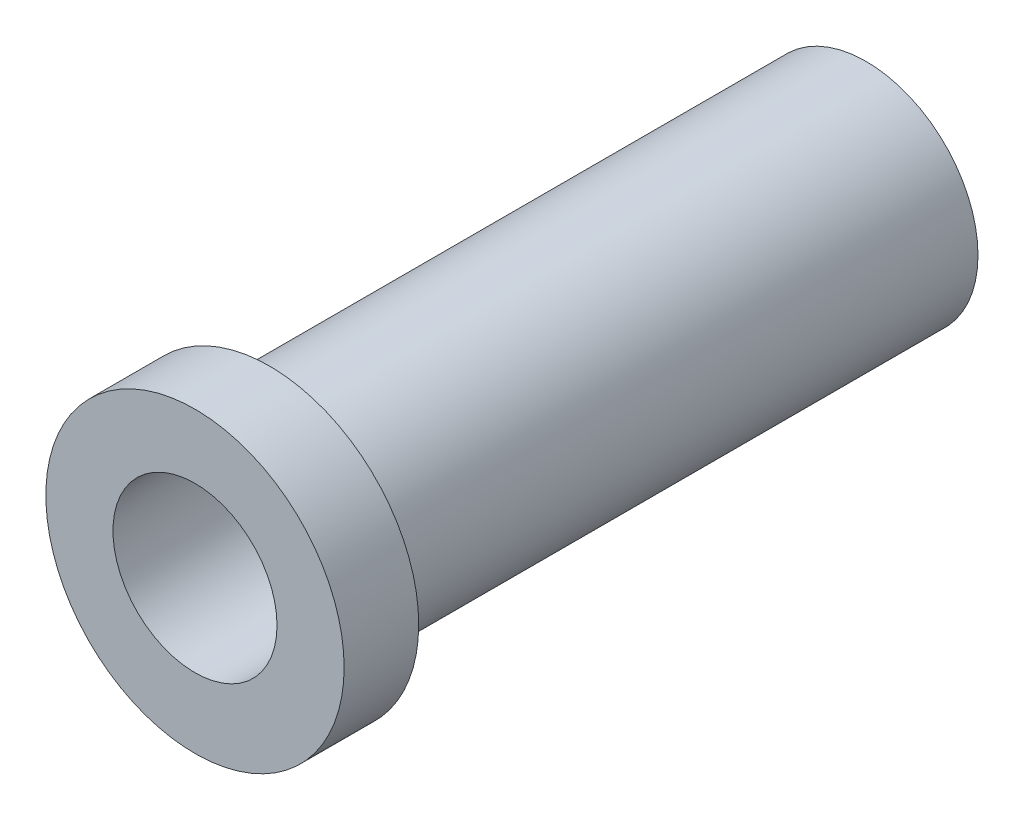
ISO-10303-21;
HEADER;
FILE_DESCRIPTION(('STEP AP214'),'2;1');
FILE_NAME('part.step','',(''),(''),'','','');
FILE_SCHEMA(('AUTOMOTIVE_DESIGN { 1 0 10303 214 1 1 1 1 }'));
ENDSEC;
DATA;
#1=APPLICATION_CONTEXT('core data for automotive mechanical design processes');
#2=APPLICATION_PROTOCOL_DEFINITION('international standard','automotive_design',2000,#1);
#3=PRODUCT_CONTEXT('',#1,'mechanical');
#4=PRODUCT('Part','Part','',(#3));
#5=PRODUCT_RELATED_PRODUCT_CATEGORY('part','',(#4));
#6=PRODUCT_DEFINITION_FORMATION('','',#4);
#7=PRODUCT_DEFINITION_CONTEXT('part definition',#1,'design');
#8=PRODUCT_DEFINITION('design','',#6,#7);
#9=PRODUCT_DEFINITION_SHAPE('','',#8);
#10=(LENGTH_UNIT() NAMED_UNIT(*) SI_UNIT(.MILLI.,.METRE.));
#11=(NAMED_UNIT(*) PLANE_ANGLE_UNIT() SI_UNIT($,.RADIAN.));
#12=(NAMED_UNIT(*) SI_UNIT($,.STERADIAN.) SOLID_ANGLE_UNIT());
#13=UNCERTAINTY_MEASURE_WITH_UNIT(LENGTH_MEASURE(1.E-05),#10,'distance_accuracy_value','');
#14=(GEOMETRIC_REPRESENTATION_CONTEXT(3) GLOBAL_UNCERTAINTY_ASSIGNED_CONTEXT((#13)) GLOBAL_UNIT_ASSIGNED_CONTEXT((#10,
#11,#12)) REPRESENTATION_CONTEXT('',''));
#15=CARTESIAN_POINT('',(0.,0.,0.));
#16=DIRECTION('',(0.,0.,1.));
#17=DIRECTION('',(1.,0.,0.));
#18=AXIS2_PLACEMENT_3D('',#15,#16,#17);
#19=CARTESIAN_POINT('',(0.,0.,-40.));
#20=DIRECTION('',(0.,0.,1.));
#21=DIRECTION('',(1.,0.,0.));
#22=AXIS2_PLACEMENT_3D('',#19,#20,#21);
#23=CYLINDRICAL_SURFACE('',#22,5.5);
#24=CARTESIAN_POINT('',(0.,0.,-40.));
#25=DIRECTION('',(0.,0.,1.));
#26=DIRECTION('',(1.,0.,0.));
#27=AXIS2_PLACEMENT_3D('',#24,#25,#26);
#28=CIRCLE('',#27,5.5);
#29=CARTESIAN_POINT('',(5.50000000000002,0.,-40.));
#30=VERTEX_POINT('',#29);
#31=EDGE_CURVE('E47',#30,#30,#28,.T.);
#32=ORIENTED_EDGE('',*,*,#31,.F.);
#33=EDGE_LOOP('',(#32));
#34=FACE_BOUND('',#33,.T.);
#35=CARTESIAN_POINT('',(0.,0.,5.));
#36=DIRECTION('',(0.,0.,1.));
#37=DIRECTION('',(1.,0.,0.));
#38=AXIS2_PLACEMENT_3D('',#35,#36,#37);
#39=CIRCLE('',#38,5.5);
#40=CARTESIAN_POINT('',(5.50000000000002,0.,5.));
#41=VERTEX_POINT('',#40);
#42=EDGE_CURVE('E60',#41,#41,#39,.T.);
#43=ORIENTED_EDGE('',*,*,#42,.T.);
#44=EDGE_LOOP('',(#43));
#45=FACE_BOUND('',#44,.T.);
#46=ADVANCED_FACE('F39',(#34,#45),#23,.F.);
#47=CARTESIAN_POINT('',(0.,0.,-40.));
#48=DIRECTION('',(0.,0.,1.));
#49=DIRECTION('',(1.,0.,0.));
#50=AXIS2_PLACEMENT_3D('',#47,#48,#49);
#51=CYLINDRICAL_SURFACE('',#50,7.5);
#52=CARTESIAN_POINT('',(0.,0.,-40.));
#53=DIRECTION('',(0.,0.,1.));
#54=DIRECTION('',(1.,0.,0.));
#55=AXIS2_PLACEMENT_3D('',#52,#53,#54);
#56=CIRCLE('',#55,7.5);
#57=CARTESIAN_POINT('',(7.50000000000003,0.,-40.));
#58=VERTEX_POINT('',#57);
#59=EDGE_CURVE('E10',#58,#58,#56,.T.);
#60=ORIENTED_EDGE('',*,*,#59,.T.);
#61=EDGE_LOOP('',(#60));
#62=FACE_BOUND('',#61,.T.);
#63=CARTESIAN_POINT('',(0.,0.,0.));
#64=DIRECTION('',(0.,0.,1.));
#65=DIRECTION('',(1.,0.,0.));
#66=AXIS2_PLACEMENT_3D('',#63,#64,#65);
#67=CIRCLE('',#66,7.5);
#68=CARTESIAN_POINT('',(7.50000000000003,0.,0.));
#69=VERTEX_POINT('',#68);
#70=EDGE_CURVE('E42',#69,#69,#67,.T.);
#71=ORIENTED_EDGE('',*,*,#70,.F.);
#72=EDGE_LOOP('',(#71));
#73=FACE_BOUND('',#72,.T.);
#74=ADVANCED_FACE('F89',(#62,#73),#51,.T.);
#75=CARTESIAN_POINT('',(0.,0.,-40.));
#76=DIRECTION('',(0.,0.,1.));
#77=DIRECTION('',(1.,0.,0.));
#78=AXIS2_PLACEMENT_3D('',#75,#76,#77);
#79=PLANE('',#78);
#80=ORIENTED_EDGE('',*,*,#31,.T.);
#81=EDGE_LOOP('',(#80));
#82=FACE_BOUND('',#81,.T.);
#83=ORIENTED_EDGE('',*,*,#59,.F.);
#84=EDGE_LOOP('',(#83));
#85=FACE_BOUND('',#84,.T.);
#86=ADVANCED_FACE('F75',(#82,#85),#79,.F.);
#87=CARTESIAN_POINT('',(0.,-0.190863113120388,5.));
#88=DIRECTION('',(0.,0.,-1.));
#89=DIRECTION('',(-1.,0.,0.));
#90=AXIS2_PLACEMENT_3D('',#87,#88,#89);
#91=CYLINDRICAL_SURFACE('',#90,10.);
#92=CARTESIAN_POINT('',(0.,-0.190863113120388,5.));
#93=DIRECTION('',(0.,0.,1.));
#94=DIRECTION('',(1.,0.,0.));
#95=AXIS2_PLACEMENT_3D('',#92,#93,#94);
#96=CIRCLE('',#95,10.);
#97=CARTESIAN_POINT('',(10.,-0.190863113120388,5.));
#98=VERTEX_POINT('',#97);
#99=EDGE_CURVE('E59',#98,#98,#96,.T.);
#100=ORIENTED_EDGE('',*,*,#99,.F.);
#101=EDGE_LOOP('',(#100));
#102=FACE_BOUND('',#101,.T.);
#103=CARTESIAN_POINT('',(0.,-0.190863113120388,0.));
#104=DIRECTION('',(0.,0.,1.));
#105=DIRECTION('',(1.,0.,0.));
#106=AXIS2_PLACEMENT_3D('',#103,#104,#105);
#107=CIRCLE('',#106,10.);
#108=CARTESIAN_POINT('',(10.,-0.190863113120388,0.));
#109=VERTEX_POINT('',#108);
#110=EDGE_CURVE('E55',#109,#109,#107,.T.);
#111=ORIENTED_EDGE('',*,*,#110,.T.);
#112=EDGE_LOOP('',(#111));
#113=FACE_BOUND('',#112,.T.);
#114=ADVANCED_FACE('F72',(#102,#113),#91,.T.);
#115=CARTESIAN_POINT('',(0.,0.,5.));
#116=DIRECTION('',(0.,0.,1.));
#117=DIRECTION('',(1.,0.,0.));
#118=AXIS2_PLACEMENT_3D('',#115,#116,#117);
#119=PLANE('',#118);
#120=ORIENTED_EDGE('',*,*,#99,.T.);
#121=EDGE_LOOP('',(#120));
#122=FACE_BOUND('',#121,.T.);
#123=ORIENTED_EDGE('',*,*,#42,.F.);
#124=EDGE_LOOP('',(#123));
#125=FACE_BOUND('',#124,.T.);
#126=ADVANCED_FACE('F69',(#122,#125),#119,.T.);
#127=CARTESIAN_POINT('',(0.,0.,0.));
#128=DIRECTION('',(0.,0.,1.));
#129=DIRECTION('',(1.,0.,0.));
#130=AXIS2_PLACEMENT_3D('',#127,#128,#129);
#131=PLANE('',#130);
#132=ORIENTED_EDGE('',*,*,#70,.T.);
#133=EDGE_LOOP('',(#132));
#134=FACE_BOUND('',#133,.T.);
#135=ORIENTED_EDGE('',*,*,#110,.F.);
#136=EDGE_LOOP('',(#135));
#137=FACE_BOUND('',#136,.T.);
#138=ADVANCED_FACE('F79',(#134,#137),#131,.F.);
#139=CLOSED_SHELL('',(#46,#74,#86,#114,#126,#138));
#140=MANIFOLD_SOLID_BREP('B2',#139);
#141=ADVANCED_BREP_SHAPE_REPRESENTATION('',(#18,#140),#14);
#142=SHAPE_DEFINITION_REPRESENTATION(#9,#141);
ENDSEC;
END-ISO-10303-21;
